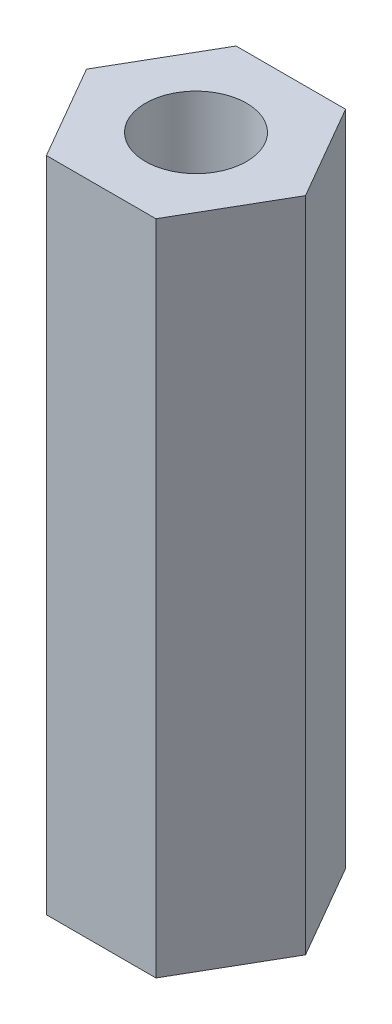
ISO-10303-21;
HEADER;
FILE_DESCRIPTION(('STEP AP214'),'2;1');
FILE_NAME('part.step','',(''),(''),'','','');
FILE_SCHEMA(('AUTOMOTIVE_DESIGN { 1 0 10303 214 1 1 1 1 }'));
ENDSEC;
DATA;
#1=APPLICATION_CONTEXT('core data for automotive mechanical design processes');
#2=APPLICATION_PROTOCOL_DEFINITION('international standard','automotive_design',2000,#1);
#3=PRODUCT_CONTEXT('',#1,'mechanical');
#4=PRODUCT('Part','Part','',(#3));
#5=PRODUCT_RELATED_PRODUCT_CATEGORY('part','',(#4));
#6=PRODUCT_DEFINITION_FORMATION('','',#4);
#7=PRODUCT_DEFINITION_CONTEXT('part definition',#1,'design');
#8=PRODUCT_DEFINITION('design','',#6,#7);
#9=PRODUCT_DEFINITION_SHAPE('','',#8);
#10=(LENGTH_UNIT() NAMED_UNIT(*) SI_UNIT(.MILLI.,.METRE.));
#11=(NAMED_UNIT(*) PLANE_ANGLE_UNIT() SI_UNIT($,.RADIAN.));
#12=(NAMED_UNIT(*) SI_UNIT($,.STERADIAN.) SOLID_ANGLE_UNIT());
#13=UNCERTAINTY_MEASURE_WITH_UNIT(LENGTH_MEASURE(1.E-05),#10,'distance_accuracy_value','');
#14=(GEOMETRIC_REPRESENTATION_CONTEXT(3) GLOBAL_UNCERTAINTY_ASSIGNED_CONTEXT((#13)) GLOBAL_UNIT_ASSIGNED_CONTEXT((#10,
#11,#12)) REPRESENTATION_CONTEXT('',''));
#15=CARTESIAN_POINT('',(0.,0.,0.));
#16=DIRECTION('',(0.,0.,1.));
#17=DIRECTION('',(1.,0.,0.));
#18=AXIS2_PLACEMENT_3D('',#15,#16,#17);
#19=CARTESIAN_POINT('',(0.,26.,0.));
#20=DIRECTION('',(0.,1.,0.));
#21=DIRECTION('',(0.,0.,1.));
#22=AXIS2_PLACEMENT_3D('',#19,#20,#21);
#23=PLANE('',#22);
#24=DIRECTION('',(-0.5,0.,-0.866025403784438));
#25=VECTOR('',#24,1.);
#26=CARTESIAN_POINT('',(4.33012701892219,26.,0.));
#27=LINE('',#26,#25);
#28=CARTESIAN_POINT('',(4.33012701892219,26.,0.));
#29=VERTEX_POINT('',#28);
#30=CARTESIAN_POINT('',(2.1650635094611,26.,-3.75));
#31=VERTEX_POINT('',#30);
#32=EDGE_CURVE('E135',#29,#31,#27,.T.);
#33=ORIENTED_EDGE('',*,*,#32,.T.);
#34=DIRECTION('',(-1.,0.,0.));
#35=VECTOR('',#34,1.);
#36=CARTESIAN_POINT('',(2.1650635094611,26.,-3.75));
#37=LINE('',#36,#35);
#38=CARTESIAN_POINT('',(-2.1650635094611,26.,-3.75));
#39=VERTEX_POINT('',#38);
#40=EDGE_CURVE('E93',#31,#39,#37,.T.);
#41=ORIENTED_EDGE('',*,*,#40,.T.);
#42=DIRECTION('',(-0.5,0.,0.866025403784439));
#43=VECTOR('',#42,1.);
#44=CARTESIAN_POINT('',(-2.1650635094611,26.,-3.75));
#45=LINE('',#44,#43);
#46=CARTESIAN_POINT('',(-4.33012701892219,26.,0.));
#47=VERTEX_POINT('',#46);
#48=EDGE_CURVE('E106',#39,#47,#45,.T.);
#49=ORIENTED_EDGE('',*,*,#48,.T.);
#50=DIRECTION('',(0.5,0.,0.866025403784438));
#51=VECTOR('',#50,1.);
#52=CARTESIAN_POINT('',(-4.33012701892219,26.,0.));
#53=LINE('',#52,#51);
#54=CARTESIAN_POINT('',(-2.16506350946109,26.,3.75));
#55=VERTEX_POINT('',#54);
#56=EDGE_CURVE('E100',#47,#55,#53,.T.);
#57=ORIENTED_EDGE('',*,*,#56,.T.);
#58=DIRECTION('',(1.,0.,0.));
#59=VECTOR('',#58,1.);
#60=CARTESIAN_POINT('',(-2.16506350946109,26.,3.75));
#61=LINE('',#60,#59);
#62=CARTESIAN_POINT('',(2.1650635094611,26.,3.75));
#63=VERTEX_POINT('',#62);
#64=EDGE_CURVE('E104',#55,#63,#61,.T.);
#65=ORIENTED_EDGE('',*,*,#64,.T.);
#66=DIRECTION('',(0.5,0.,-0.866025403784439));
#67=VECTOR('',#66,1.);
#68=CARTESIAN_POINT('',(2.1650635094611,26.,3.75));
#69=LINE('',#68,#67);
#70=EDGE_CURVE('E56',#63,#29,#69,.T.);
#71=ORIENTED_EDGE('',*,*,#70,.T.);
#72=EDGE_LOOP('',(#33,#41,#49,#57,#65,#71));
#73=FACE_BOUND('',#72,.T.);
#74=CARTESIAN_POINT('',(0.,26.,0.));
#75=DIRECTION('',(0.,1.,0.));
#76=DIRECTION('',(0.,0.,1.));
#77=AXIS2_PLACEMENT_3D('',#74,#75,#76);
#78=CIRCLE('',#77,2.);
#79=CARTESIAN_POINT('',(0.,26.,-2.));
#80=VERTEX_POINT('',#79);
#81=EDGE_CURVE('E128',#80,#80,#78,.T.);
#82=ORIENTED_EDGE('',*,*,#81,.F.);
#83=EDGE_LOOP('',(#82));
#84=FACE_BOUND('',#83,.T.);
#85=ADVANCED_FACE('F39',(#73,#84),#23,.T.);
#86=CARTESIAN_POINT('',(0.,0.,0.));
#87=DIRECTION('',(0.,1.,0.));
#88=DIRECTION('',(0.,0.,1.));
#89=AXIS2_PLACEMENT_3D('',#86,#87,#88);
#90=PLANE('',#89);
#91=DIRECTION('',(-0.5,0.,-0.866025403784438));
#92=VECTOR('',#91,1.);
#93=CARTESIAN_POINT('',(4.33012701892219,0.,0.));
#94=LINE('',#93,#92);
#95=CARTESIAN_POINT('',(4.33012701892219,0.,0.));
#96=VERTEX_POINT('',#95);
#97=CARTESIAN_POINT('',(2.1650635094611,0.,-3.75));
#98=VERTEX_POINT('',#97);
#99=EDGE_CURVE('E124',#96,#98,#94,.T.);
#100=ORIENTED_EDGE('',*,*,#99,.F.);
#101=DIRECTION('',(0.5,0.,-0.866025403784439));
#102=VECTOR('',#101,1.);
#103=CARTESIAN_POINT('',(2.1650635094611,0.,3.75));
#104=LINE('',#103,#102);
#105=CARTESIAN_POINT('',(2.1650635094611,0.,3.75));
#106=VERTEX_POINT('',#105);
#107=EDGE_CURVE('E85',#106,#96,#104,.T.);
#108=ORIENTED_EDGE('',*,*,#107,.F.);
#109=DIRECTION('',(1.,0.,0.));
#110=VECTOR('',#109,1.);
#111=CARTESIAN_POINT('',(-2.16506350946109,0.,3.75));
#112=LINE('',#111,#110);
#113=CARTESIAN_POINT('',(-2.16506350946109,0.,3.75));
#114=VERTEX_POINT('',#113);
#115=EDGE_CURVE('E79',#114,#106,#112,.T.);
#116=ORIENTED_EDGE('',*,*,#115,.F.);
#117=DIRECTION('',(0.5,0.,0.866025403784438));
#118=VECTOR('',#117,1.);
#119=CARTESIAN_POINT('',(-4.33012701892219,0.,0.));
#120=LINE('',#119,#118);
#121=CARTESIAN_POINT('',(-4.33012701892219,0.,0.));
#122=VERTEX_POINT('',#121);
#123=EDGE_CURVE('E114',#122,#114,#120,.T.);
#124=ORIENTED_EDGE('',*,*,#123,.F.);
#125=DIRECTION('',(-0.5,0.,0.866025403784439));
#126=VECTOR('',#125,1.);
#127=CARTESIAN_POINT('',(-2.1650635094611,0.,-3.75));
#128=LINE('',#127,#126);
#129=CARTESIAN_POINT('',(-2.1650635094611,0.,-3.75));
#130=VERTEX_POINT('',#129);
#131=EDGE_CURVE('E130',#130,#122,#128,.T.);
#132=ORIENTED_EDGE('',*,*,#131,.F.);
#133=DIRECTION('',(-1.,0.,0.));
#134=VECTOR('',#133,1.);
#135=CARTESIAN_POINT('',(2.1650635094611,0.,-3.75));
#136=LINE('',#135,#134);
#137=EDGE_CURVE('E127',#98,#130,#136,.T.);
#138=ORIENTED_EDGE('',*,*,#137,.F.);
#139=EDGE_LOOP('',(#100,#108,#116,#124,#132,#138));
#140=FACE_BOUND('',#139,.T.);
#141=CARTESIAN_POINT('',(0.,0.,0.));
#142=DIRECTION('',(0.,1.,0.));
#143=DIRECTION('',(0.,0.,1.));
#144=AXIS2_PLACEMENT_3D('',#141,#142,#143);
#145=CIRCLE('',#144,2.);
#146=CARTESIAN_POINT('',(0.,0.,-2.));
#147=VERTEX_POINT('',#146);
#148=EDGE_CURVE('E246',#147,#147,#145,.T.);
#149=ORIENTED_EDGE('',*,*,#148,.T.);
#150=EDGE_LOOP('',(#149));
#151=FACE_BOUND('',#150,.T.);
#152=ADVANCED_FACE('F144',(#140,#151),#90,.F.);
#153=CARTESIAN_POINT('',(4.33012701892219,26.,0.));
#154=DIRECTION('',(-0.866025403784438,0.,0.5));
#155=DIRECTION('',(0.5,0.,0.866025403784439));
#156=AXIS2_PLACEMENT_3D('',#153,#154,#155);
#157=PLANE('',#156);
#158=ORIENTED_EDGE('',*,*,#99,.T.);
#159=DIRECTION('',(0.,-1.,0.));
#160=VECTOR('',#159,1.);
#161=CARTESIAN_POINT('',(2.1650635094611,26.,-3.75));
#162=LINE('',#161,#160);
#163=EDGE_CURVE('E11',#31,#98,#162,.T.);
#164=ORIENTED_EDGE('',*,*,#163,.F.);
#165=ORIENTED_EDGE('',*,*,#32,.F.);
#166=DIRECTION('',(0.,-1.,0.));
#167=VECTOR('',#166,1.);
#168=CARTESIAN_POINT('',(4.33012701892219,26.,0.));
#169=LINE('',#168,#167);
#170=EDGE_CURVE('E120',#29,#96,#169,.T.);
#171=ORIENTED_EDGE('',*,*,#170,.T.);
#172=EDGE_LOOP('',(#158,#164,#165,#171));
#173=FACE_BOUND('',#172,.T.);
#174=ADVANCED_FACE('F41',(#173),#157,.F.);
#175=CARTESIAN_POINT('',(2.1650635094611,26.,-3.75));
#176=DIRECTION('',(0.,0.,1.));
#177=DIRECTION('',(1.,0.,0.));
#178=AXIS2_PLACEMENT_3D('',#175,#176,#177);
#179=PLANE('',#178);
#180=ORIENTED_EDGE('',*,*,#137,.T.);
#181=DIRECTION('',(0.,-1.,0.));
#182=VECTOR('',#181,1.);
#183=CARTESIAN_POINT('',(-2.1650635094611,26.,-3.75));
#184=LINE('',#183,#182);
#185=EDGE_CURVE('E48',#39,#130,#184,.T.);
#186=ORIENTED_EDGE('',*,*,#185,.F.);
#187=ORIENTED_EDGE('',*,*,#40,.F.);
#188=ORIENTED_EDGE('',*,*,#163,.T.);
#189=EDGE_LOOP('',(#180,#186,#187,#188));
#190=FACE_BOUND('',#189,.T.);
#191=ADVANCED_FACE('F169',(#190),#179,.F.);
#192=CARTESIAN_POINT('',(-2.1650635094611,26.,-3.75));
#193=DIRECTION('',(0.866025403784439,0.,0.5));
#194=DIRECTION('',(0.5,0.,-0.866025403784439));
#195=AXIS2_PLACEMENT_3D('',#192,#193,#194);
#196=PLANE('',#195);
#197=ORIENTED_EDGE('',*,*,#131,.T.);
#198=DIRECTION('',(0.,-1.,0.));
#199=VECTOR('',#198,1.);
#200=CARTESIAN_POINT('',(-4.33012701892219,26.,0.));
#201=LINE('',#200,#199);
#202=EDGE_CURVE('E115',#47,#122,#201,.T.);
#203=ORIENTED_EDGE('',*,*,#202,.F.);
#204=ORIENTED_EDGE('',*,*,#48,.F.);
#205=ORIENTED_EDGE('',*,*,#185,.T.);
#206=EDGE_LOOP('',(#197,#203,#204,#205));
#207=FACE_BOUND('',#206,.T.);
#208=ADVANCED_FACE('F141',(#207),#196,.F.);
#209=CARTESIAN_POINT('',(-4.33012701892219,26.,0.));
#210=DIRECTION('',(0.866025403784438,0.,-0.5));
#211=DIRECTION('',(-0.5,0.,-0.866025403784439));
#212=AXIS2_PLACEMENT_3D('',#209,#210,#211);
#213=PLANE('',#212);
#214=ORIENTED_EDGE('',*,*,#123,.T.);
#215=DIRECTION('',(0.,-1.,0.));
#216=VECTOR('',#215,1.);
#217=CARTESIAN_POINT('',(-2.16506350946109,26.,3.75));
#218=LINE('',#217,#216);
#219=EDGE_CURVE('E111',#55,#114,#218,.T.);
#220=ORIENTED_EDGE('',*,*,#219,.F.);
#221=ORIENTED_EDGE('',*,*,#56,.F.);
#222=ORIENTED_EDGE('',*,*,#202,.T.);
#223=EDGE_LOOP('',(#214,#220,#221,#222));
#224=FACE_BOUND('',#223,.T.);
#225=ADVANCED_FACE('F112',(#224),#213,.F.);
#226=CARTESIAN_POINT('',(-2.16506350946109,26.,3.75));
#227=DIRECTION('',(0.,0.,-1.));
#228=DIRECTION('',(-1.,0.,0.));
#229=AXIS2_PLACEMENT_3D('',#226,#227,#228);
#230=PLANE('',#229);
#231=ORIENTED_EDGE('',*,*,#115,.T.);
#232=DIRECTION('',(0.,-1.,0.));
#233=VECTOR('',#232,1.);
#234=CARTESIAN_POINT('',(2.1650635094611,26.,3.75));
#235=LINE('',#234,#233);
#236=EDGE_CURVE('E116',#63,#106,#235,.T.);
#237=ORIENTED_EDGE('',*,*,#236,.F.);
#238=ORIENTED_EDGE('',*,*,#64,.F.);
#239=ORIENTED_EDGE('',*,*,#219,.T.);
#240=EDGE_LOOP('',(#231,#237,#238,#239));
#241=FACE_BOUND('',#240,.T.);
#242=ADVANCED_FACE('F118',(#241),#230,.F.);
#243=CARTESIAN_POINT('',(2.1650635094611,26.,3.75));
#244=DIRECTION('',(-0.866025403784439,0.,-0.5));
#245=DIRECTION('',(-0.5,0.,0.866025403784439));
#246=AXIS2_PLACEMENT_3D('',#243,#244,#245);
#247=PLANE('',#246);
#248=ORIENTED_EDGE('',*,*,#107,.T.);
#249=ORIENTED_EDGE('',*,*,#170,.F.);
#250=ORIENTED_EDGE('',*,*,#70,.F.);
#251=ORIENTED_EDGE('',*,*,#236,.T.);
#252=EDGE_LOOP('',(#248,#249,#250,#251));
#253=FACE_BOUND('',#252,.T.);
#254=ADVANCED_FACE('F149',(#253),#247,.F.);
#255=CARTESIAN_POINT('',(0.,26.,0.));
#256=DIRECTION('',(0.,-1.,0.));
#257=DIRECTION('',(0.,0.,-1.));
#258=AXIS2_PLACEMENT_3D('',#255,#256,#257);
#259=CYLINDRICAL_SURFACE('',#258,2.);
#260=CARTESIAN_POINT('',(0.,26.,-2.));
#261=CARTESIAN_POINT('',(0.,25.7291666666667,-2.));
#262=CARTESIAN_POINT('',(0.,25.4583333333333,-2.));
#263=CARTESIAN_POINT('',(0.,24.9166666666667,-2.));
#264=CARTESIAN_POINT('',(0.,24.6458333333333,-2.));
#265=CARTESIAN_POINT('',(0.,24.1041666666667,-2.));
#266=CARTESIAN_POINT('',(0.,23.8333333333333,-2.));
#267=CARTESIAN_POINT('',(0.,23.2916666666667,-2.));
#268=CARTESIAN_POINT('',(0.,23.0208333333333,-2.));
#269=CARTESIAN_POINT('',(0.,22.4791666666667,-2.));
#270=CARTESIAN_POINT('',(0.,22.2083333333333,-2.));
#271=CARTESIAN_POINT('',(0.,21.6666666666667,-2.));
#272=CARTESIAN_POINT('',(0.,21.3958333333333,-2.));
#273=CARTESIAN_POINT('',(0.,20.8541666666667,-2.));
#274=CARTESIAN_POINT('',(0.,20.5833333333333,-2.));
#275=CARTESIAN_POINT('',(0.,20.0416666666667,-2.));
#276=CARTESIAN_POINT('',(0.,19.7708333333333,-2.));
#277=CARTESIAN_POINT('',(0.,19.2291666666667,-2.));
#278=CARTESIAN_POINT('',(0.,18.9583333333333,-2.));
#279=CARTESIAN_POINT('',(0.,18.4166666666667,-2.));
#280=CARTESIAN_POINT('',(0.,18.1458333333333,-2.));
#281=CARTESIAN_POINT('',(0.,17.6041666666667,-2.));
#282=CARTESIAN_POINT('',(0.,17.3333333333333,-2.));
#283=CARTESIAN_POINT('',(0.,16.7916666666667,-2.));
#284=CARTESIAN_POINT('',(0.,16.5208333333333,-2.));
#285=CARTESIAN_POINT('',(0.,15.9791666666667,-2.));
#286=CARTESIAN_POINT('',(0.,15.7083333333333,-2.));
#287=CARTESIAN_POINT('',(0.,15.1666666666667,-2.));
#288=CARTESIAN_POINT('',(0.,14.8958333333333,-2.));
#289=CARTESIAN_POINT('',(0.,14.3541666666667,-2.));
#290=CARTESIAN_POINT('',(0.,14.0833333333333,-2.));
#291=CARTESIAN_POINT('',(0.,13.5416666666667,-2.));
#292=CARTESIAN_POINT('',(0.,13.2708333333333,-2.));
#293=CARTESIAN_POINT('',(0.,12.7291666666667,-2.));
#294=CARTESIAN_POINT('',(0.,12.4583333333333,-2.));
#295=CARTESIAN_POINT('',(0.,11.9166666666667,-2.));
#296=CARTESIAN_POINT('',(0.,11.6458333333333,-2.));
#297=CARTESIAN_POINT('',(0.,11.1041666666667,-2.));
#298=CARTESIAN_POINT('',(0.,10.8333333333333,-2.));
#299=CARTESIAN_POINT('',(0.,10.2916666666667,-2.));
#300=CARTESIAN_POINT('',(0.,10.0208333333333,-2.));
#301=CARTESIAN_POINT('',(0.,9.47916666666667,-2.));
#302=CARTESIAN_POINT('',(0.,9.20833333333333,-2.));
#303=CARTESIAN_POINT('',(0.,8.66666666666667,-2.));
#304=CARTESIAN_POINT('',(0.,8.39583333333333,-2.));
#305=CARTESIAN_POINT('',(0.,7.85416666666667,-2.));
#306=CARTESIAN_POINT('',(0.,7.58333333333333,-2.));
#307=CARTESIAN_POINT('',(0.,7.04166666666667,-2.));
#308=CARTESIAN_POINT('',(0.,6.77083333333333,-2.));
#309=CARTESIAN_POINT('',(0.,6.22916666666667,-2.));
#310=CARTESIAN_POINT('',(0.,5.95833333333333,-2.));
#311=CARTESIAN_POINT('',(0.,5.41666666666667,-2.));
#312=CARTESIAN_POINT('',(0.,5.14583333333333,-2.));
#313=CARTESIAN_POINT('',(0.,4.60416666666667,-2.));
#314=CARTESIAN_POINT('',(0.,4.33333333333333,-2.));
#315=CARTESIAN_POINT('',(0.,3.79166666666667,-2.));
#316=CARTESIAN_POINT('',(0.,3.52083333333333,-2.));
#317=CARTESIAN_POINT('',(0.,2.97916666666667,-2.));
#318=CARTESIAN_POINT('',(0.,2.70833333333333,-2.));
#319=CARTESIAN_POINT('',(0.,2.16666666666667,-2.));
#320=CARTESIAN_POINT('',(0.,1.89583333333333,-2.));
#321=CARTESIAN_POINT('',(0.,1.35416666666667,-2.));
#322=CARTESIAN_POINT('',(0.,1.08333333333333,-2.));
#323=CARTESIAN_POINT('',(0.,0.541666666666667,-2.));
#324=CARTESIAN_POINT('',(0.,0.270833333333334,-2.));
#325=CARTESIAN_POINT('',(0.,0.,-2.));
#326=B_SPLINE_CURVE_WITH_KNOTS('',3,(#260,#261,#262,#263,#264,#265,#266,#267,#268,#269,#270,
#271,#272,#273,#274,#275,#276,#277,#278,#279,#280,#281,#282,#283,#284,#285,#286,#287,#288,#289,
#290,#291,#292,#293,#294,#295,#296,#297,#298,#299,#300,#301,#302,#303,#304,#305,#306,#307,#308,
#309,#310,#311,#312,#313,#314,#315,#316,#317,#318,#319,#320,#321,#322,#323,#324,#325),
.UNSPECIFIED.,.F.,.F.,(4,2,2,2,2,2,2,2,2,2,2,2,2,2,2,2,2,2,2,2,2,2,2,2,2,2,2,2,2,2,2,2,4),(0.,
0.812500000000001,1.625,2.4375,3.25,4.0625,4.875,5.6875,6.5,7.3125,8.125,8.9375,9.75,10.5625,
11.375,12.1875,13.,13.8125,14.625,15.4375,16.25,17.0625,17.875,18.6875,19.5,20.3125,21.125,
21.9375,22.75,23.5625,24.375,25.1875,26.),.UNSPECIFIED.);
#327=EDGE_CURVE('BSEAM151',#80,#147,#326,.T.);
#328=ORIENTED_EDGE('',*,*,#81,.T.);
#329=ORIENTED_EDGE('',*,*,#148,.F.);
#330=ORIENTED_EDGE('',*,*,#327,.T.);
#331=ORIENTED_EDGE('',*,*,#327,.F.);
#332=EDGE_LOOP('',(#328,#330,#329,#331));
#333=FACE_BOUND('',#332,.T.);
#334=ADVANCED_FACE('F151',(#333),#259,.F.);
#335=CLOSED_SHELL('',(#85,#152,#174,#191,#208,#225,#242,#254,#334));
#336=MANIFOLD_SOLID_BREP('B2',#335);
#337=ADVANCED_BREP_SHAPE_REPRESENTATION('',(#18,#336),#14);
#338=SHAPE_DEFINITION_REPRESENTATION(#9,#337);
ENDSEC;
END-ISO-10303-21;
